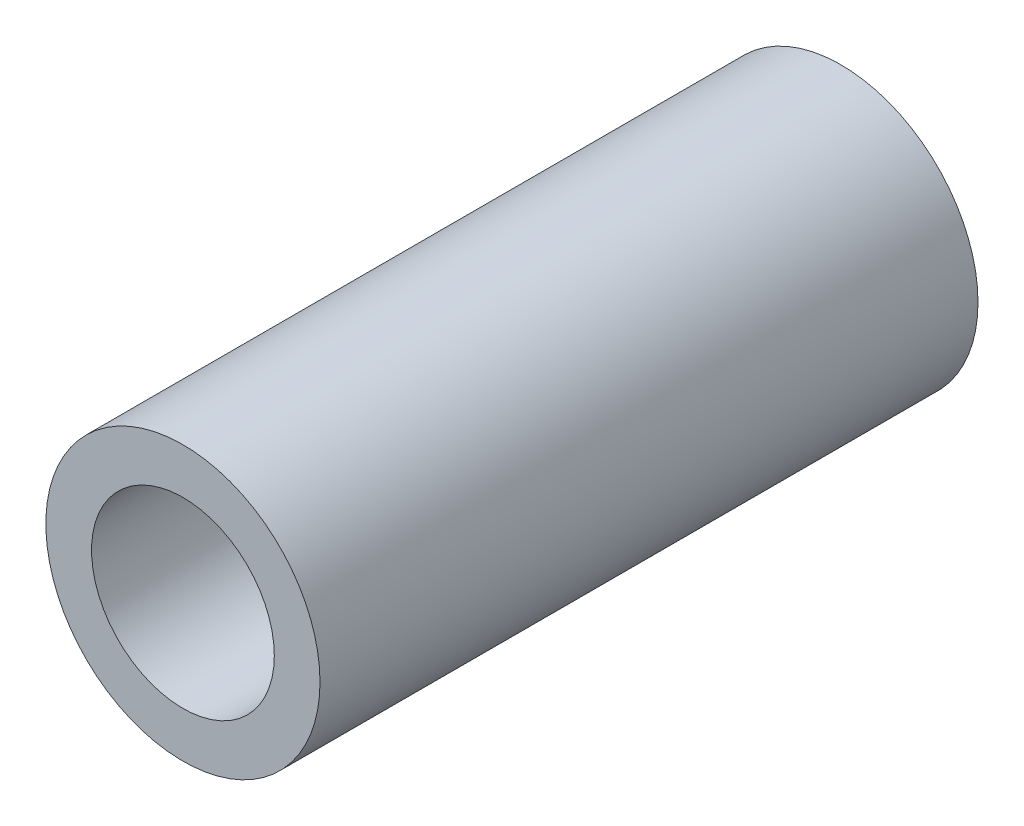
ISO-10303-21;
HEADER;
FILE_DESCRIPTION(('STEP AP214'),'2;1');
FILE_NAME('part.step','',(''),(''),'','','');
FILE_SCHEMA(('AUTOMOTIVE_DESIGN { 1 0 10303 214 1 1 1 1 }'));
ENDSEC;
DATA;
#1=APPLICATION_CONTEXT('core data for automotive mechanical design processes');
#2=APPLICATION_PROTOCOL_DEFINITION('international standard','automotive_design',2000,#1);
#3=PRODUCT_CONTEXT('',#1,'mechanical');
#4=PRODUCT('Part','Part','',(#3));
#5=PRODUCT_RELATED_PRODUCT_CATEGORY('part','',(#4));
#6=PRODUCT_DEFINITION_FORMATION('','',#4);
#7=PRODUCT_DEFINITION_CONTEXT('part definition',#1,'design');
#8=PRODUCT_DEFINITION('design','',#6,#7);
#9=PRODUCT_DEFINITION_SHAPE('','',#8);
#10=(LENGTH_UNIT() NAMED_UNIT(*) SI_UNIT(.MILLI.,.METRE.));
#11=(NAMED_UNIT(*) PLANE_ANGLE_UNIT() SI_UNIT($,.RADIAN.));
#12=(NAMED_UNIT(*) SI_UNIT($,.STERADIAN.) SOLID_ANGLE_UNIT());
#13=UNCERTAINTY_MEASURE_WITH_UNIT(LENGTH_MEASURE(1.E-05),#10,'distance_accuracy_value','');
#14=(GEOMETRIC_REPRESENTATION_CONTEXT(3) GLOBAL_UNCERTAINTY_ASSIGNED_CONTEXT((#13)) GLOBAL_UNIT_ASSIGNED_CONTEXT((#10,
#11,#12)) REPRESENTATION_CONTEXT('',''));
#15=CARTESIAN_POINT('',(0.,0.,0.));
#16=DIRECTION('',(0.,0.,1.));
#17=DIRECTION('',(1.,0.,0.));
#18=AXIS2_PLACEMENT_3D('',#15,#16,#17);
#19=CARTESIAN_POINT('',(0.,0.,7.2));
#20=DIRECTION('',(0.,0.,1.));
#21=DIRECTION('',(1.,0.,0.));
#22=AXIS2_PLACEMENT_3D('',#19,#20,#21);
#23=PLANE('',#22);
#24=CARTESIAN_POINT('',(0.,0.,7.2));
#25=DIRECTION('',(0.,0.,1.));
#26=DIRECTION('',(1.,0.,0.));
#27=AXIS2_PLACEMENT_3D('',#24,#25,#26);
#28=CIRCLE('',#27,1.5);
#29=CARTESIAN_POINT('',(1.5,0.,7.2));
#30=VERTEX_POINT('',#29);
#31=EDGE_CURVE('E10',#30,#30,#28,.T.);
#32=ORIENTED_EDGE('',*,*,#31,.T.);
#33=EDGE_LOOP('',(#32));
#34=FACE_BOUND('',#33,.T.);
#35=CARTESIAN_POINT('',(0.,0.,7.2));
#36=DIRECTION('',(0.,0.,1.));
#37=DIRECTION('',(1.,0.,0.));
#38=AXIS2_PLACEMENT_3D('',#35,#36,#37);
#39=CIRCLE('',#38,1.);
#40=CARTESIAN_POINT('',(1.,0.,7.2));
#41=VERTEX_POINT('',#40);
#42=EDGE_CURVE('E46',#41,#41,#39,.T.);
#43=ORIENTED_EDGE('',*,*,#42,.F.);
#44=EDGE_LOOP('',(#43));
#45=FACE_BOUND('',#44,.T.);
#46=ADVANCED_FACE('F35',(#34,#45),#23,.T.);
#47=CARTESIAN_POINT('',(0.,0.,0.));
#48=DIRECTION('',(0.,0.,1.));
#49=DIRECTION('',(1.,0.,0.));
#50=AXIS2_PLACEMENT_3D('',#47,#48,#49);
#51=PLANE('',#50);
#52=CARTESIAN_POINT('',(0.,0.,0.));
#53=DIRECTION('',(0.,0.,1.));
#54=DIRECTION('',(1.,0.,0.));
#55=AXIS2_PLACEMENT_3D('',#52,#53,#54);
#56=CIRCLE('',#55,1.5);
#57=CARTESIAN_POINT('',(1.5,0.,0.));
#58=VERTEX_POINT('',#57);
#59=EDGE_CURVE('E39',#58,#58,#56,.T.);
#60=ORIENTED_EDGE('',*,*,#59,.F.);
#61=EDGE_LOOP('',(#60));
#62=FACE_BOUND('',#61,.T.);
#63=CARTESIAN_POINT('',(0.,0.,0.));
#64=DIRECTION('',(0.,0.,1.));
#65=DIRECTION('',(1.,0.,0.));
#66=AXIS2_PLACEMENT_3D('',#63,#64,#65);
#67=CIRCLE('',#66,1.);
#68=CARTESIAN_POINT('',(1.,0.,0.));
#69=VERTEX_POINT('',#68);
#70=EDGE_CURVE('E48',#69,#69,#67,.T.);
#71=ORIENTED_EDGE('',*,*,#70,.T.);
#72=EDGE_LOOP('',(#71));
#73=FACE_BOUND('',#72,.T.);
#74=ADVANCED_FACE('F58',(#62,#73),#51,.F.);
#75=CARTESIAN_POINT('',(0.,0.,7.2));
#76=DIRECTION('',(0.,0.,-1.));
#77=DIRECTION('',(-1.,0.,0.));
#78=AXIS2_PLACEMENT_3D('',#75,#76,#77);
#79=CYLINDRICAL_SURFACE('',#78,1.5);
#80=ORIENTED_EDGE('',*,*,#31,.F.);
#81=EDGE_LOOP('',(#80));
#82=FACE_BOUND('',#81,.T.);
#83=ORIENTED_EDGE('',*,*,#59,.T.);
#84=EDGE_LOOP('',(#83));
#85=FACE_BOUND('',#84,.T.);
#86=ADVANCED_FACE('F37',(#82,#85),#79,.T.);
#87=CARTESIAN_POINT('',(0.,0.,7.2));
#88=DIRECTION('',(0.,0.,-1.));
#89=DIRECTION('',(-1.,0.,0.));
#90=AXIS2_PLACEMENT_3D('',#87,#88,#89);
#91=CYLINDRICAL_SURFACE('',#90,1.);
#92=ORIENTED_EDGE('',*,*,#42,.T.);
#93=EDGE_LOOP('',(#92));
#94=FACE_BOUND('',#93,.T.);
#95=ORIENTED_EDGE('',*,*,#70,.F.);
#96=EDGE_LOOP('',(#95));
#97=FACE_BOUND('',#96,.T.);
#98=ADVANCED_FACE('F54',(#94,#97),#91,.F.);
#99=CLOSED_SHELL('',(#46,#74,#86,#98));
#100=MANIFOLD_SOLID_BREP('B2',#99);
#101=ADVANCED_BREP_SHAPE_REPRESENTATION('',(#18,#100),#14);
#102=SHAPE_DEFINITION_REPRESENTATION(#9,#101);
ENDSEC;
END-ISO-10303-21;
